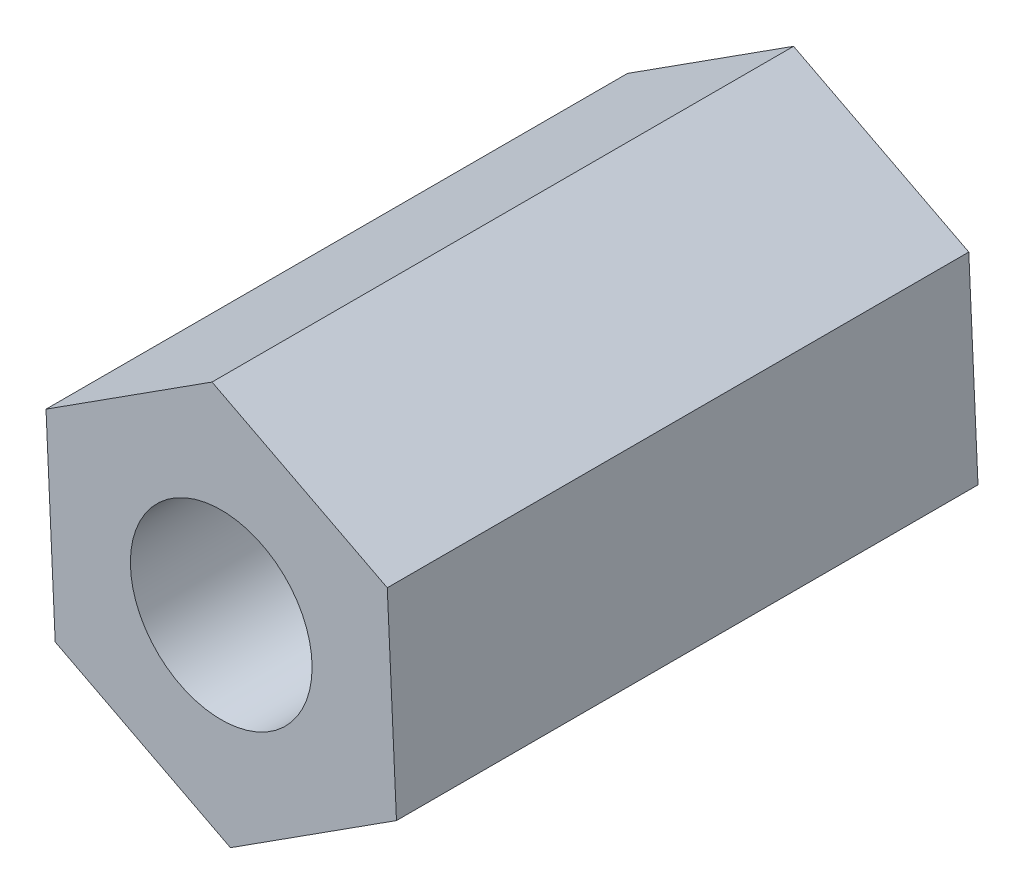
ISO-10303-21;
HEADER;
FILE_DESCRIPTION(('STEP AP214'),'2;1');
FILE_NAME('part.step','',(''),(''),'','','');
FILE_SCHEMA(('AUTOMOTIVE_DESIGN { 1 0 10303 214 1 1 1 1 }'));
ENDSEC;
DATA;
#1=APPLICATION_CONTEXT('core data for automotive mechanical design processes');
#2=APPLICATION_PROTOCOL_DEFINITION('international standard','automotive_design',2000,#1);
#3=PRODUCT_CONTEXT('',#1,'mechanical');
#4=PRODUCT('Part','Part','',(#3));
#5=PRODUCT_RELATED_PRODUCT_CATEGORY('part','',(#4));
#6=PRODUCT_DEFINITION_FORMATION('','',#4);
#7=PRODUCT_DEFINITION_CONTEXT('part definition',#1,'design');
#8=PRODUCT_DEFINITION('design','',#6,#7);
#9=PRODUCT_DEFINITION_SHAPE('','',#8);
#10=(LENGTH_UNIT() NAMED_UNIT(*) SI_UNIT(.MILLI.,.METRE.));
#11=(NAMED_UNIT(*) PLANE_ANGLE_UNIT() SI_UNIT($,.RADIAN.));
#12=(NAMED_UNIT(*) SI_UNIT($,.STERADIAN.) SOLID_ANGLE_UNIT());
#13=UNCERTAINTY_MEASURE_WITH_UNIT(LENGTH_MEASURE(1.E-05),#10,'distance_accuracy_value','');
#14=(GEOMETRIC_REPRESENTATION_CONTEXT(3) GLOBAL_UNCERTAINTY_ASSIGNED_CONTEXT((#13)) GLOBAL_UNIT_ASSIGNED_CONTEXT((#10,
#11,#12)) REPRESENTATION_CONTEXT('',''));
#15=CARTESIAN_POINT('',(0.,0.,0.));
#16=DIRECTION('',(0.,0.,1.));
#17=DIRECTION('',(1.,0.,0.));
#18=AXIS2_PLACEMENT_3D('',#15,#16,#17);
#19=CARTESIAN_POINT('',(2.28413969945886,1.46493657428891,-8.));
#20=DIRECTION('',(-0.459050481047052,-0.888410184458998,0.));
#21=DIRECTION('',(0.888410184458998,-0.459050481047052,0.));
#22=AXIS2_PLACEMENT_3D('',#19,#20,#21);
#23=PLANE('',#22);
#24=DIRECTION('',(-0.888410184458997,0.459050481047052,0.));
#25=VECTOR('',#24,1.);
#26=CARTESIAN_POINT('',(2.28413969945886,1.46493657428891,0.));
#27=LINE('',#26,#25);
#28=CARTESIAN_POINT('',(2.28413969945886,1.46493657428891,0.));
#29=VERTEX_POINT('',#28);
#30=CARTESIAN_POINT('',(-0.126602438537715,2.71059129266838,0.));
#31=VERTEX_POINT('',#30);
#32=EDGE_CURVE('E122',#29,#31,#27,.T.);
#33=ORIENTED_EDGE('',*,*,#32,.F.);
#34=DIRECTION('',(0.,0.,1.));
#35=VECTOR('',#34,1.);
#36=CARTESIAN_POINT('',(2.28413969945886,1.46493657428891,-8.));
#37=LINE('',#36,#35);
#38=CARTESIAN_POINT('',(2.28413969945886,1.46493657428891,-8.));
#39=VERTEX_POINT('',#38);
#40=EDGE_CURVE('E121',#39,#29,#37,.T.);
#41=ORIENTED_EDGE('',*,*,#40,.F.);
#42=DIRECTION('',(-0.888410184458997,0.459050481047052,0.));
#43=VECTOR('',#42,1.);
#44=CARTESIAN_POINT('',(2.28413969945886,1.46493657428891,-8.));
#45=LINE('',#44,#43);
#46=CARTESIAN_POINT('',(-0.126602438537715,2.71059129266838,-8.));
#47=VERTEX_POINT('',#46);
#48=EDGE_CURVE('E135',#39,#47,#45,.T.);
#49=ORIENTED_EDGE('',*,*,#48,.T.);
#50=DIRECTION('',(0.,0.,1.));
#51=VECTOR('',#50,1.);
#52=CARTESIAN_POINT('',(-0.126602438537715,2.71059129266838,-8.));
#53=LINE('',#52,#51);
#54=EDGE_CURVE('E11',#47,#31,#53,.T.);
#55=ORIENTED_EDGE('',*,*,#54,.T.);
#56=EDGE_LOOP('',(#33,#41,#49,#55));
#57=FACE_BOUND('',#56,.T.);
#58=ADVANCED_FACE('F39',(#57),#23,.F.);
#59=CARTESIAN_POINT('',(-0.126602438537715,2.71059129266838,-8.));
#60=DIRECTION('',(0.539860548198785,-0.841754470435713,0.));
#61=DIRECTION('',(0.841754470435713,0.539860548198785,0.));
#62=AXIS2_PLACEMENT_3D('',#59,#60,#61);
#63=PLANE('',#62);
#64=DIRECTION('',(-0.841754470435713,-0.539860548198785,0.));
#65=VECTOR('',#64,1.);
#66=CARTESIAN_POINT('',(-0.126602438537715,2.71059129266838,0.));
#67=LINE('',#66,#65);
#68=CARTESIAN_POINT('',(-2.41074213799657,1.24565471837947,0.));
#69=VERTEX_POINT('',#68);
#70=EDGE_CURVE('E124',#31,#69,#67,.T.);
#71=ORIENTED_EDGE('',*,*,#70,.F.);
#72=ORIENTED_EDGE('',*,*,#54,.F.);
#73=DIRECTION('',(-0.841754470435713,-0.539860548198785,0.));
#74=VECTOR('',#73,1.);
#75=CARTESIAN_POINT('',(-0.126602438537715,2.71059129266838,-8.));
#76=LINE('',#75,#74);
#77=CARTESIAN_POINT('',(-2.41074213799657,1.24565471837947,-8.));
#78=VERTEX_POINT('',#77);
#79=EDGE_CURVE('E87',#47,#78,#76,.T.);
#80=ORIENTED_EDGE('',*,*,#79,.T.);
#81=DIRECTION('',(0.,0.,1.));
#82=VECTOR('',#81,1.);
#83=CARTESIAN_POINT('',(-2.41074213799657,1.24565471837947,-8.));
#84=LINE('',#83,#82);
#85=EDGE_CURVE('E47',#78,#69,#84,.T.);
#86=ORIENTED_EDGE('',*,*,#85,.T.);
#87=EDGE_LOOP('',(#71,#72,#80,#86));
#88=FACE_BOUND('',#87,.T.);
#89=ADVANCED_FACE('F141',(#88),#63,.F.);
#90=CARTESIAN_POINT('',(-2.41074213799657,1.24565471837947,-8.));
#91=DIRECTION('',(0.998911029245837,0.0466557140232844,0.));
#92=DIRECTION('',(-0.0466557140232844,0.998911029245837,0.));
#93=AXIS2_PLACEMENT_3D('',#90,#91,#92);
#94=PLANE('',#93);
#95=DIRECTION('',(0.0466557140232844,-0.998911029245837,0.));
#96=VECTOR('',#95,1.);
#97=CARTESIAN_POINT('',(-2.41074213799657,1.24565471837947,0.));
#98=LINE('',#97,#96);
#99=CARTESIAN_POINT('',(-2.28413969945886,-1.46493657428891,0.));
#100=VERTEX_POINT('',#99);
#101=EDGE_CURVE('E128',#69,#100,#98,.T.);
#102=ORIENTED_EDGE('',*,*,#101,.F.);
#103=ORIENTED_EDGE('',*,*,#85,.F.);
#104=DIRECTION('',(0.0466557140232844,-0.998911029245837,0.));
#105=VECTOR('',#104,1.);
#106=CARTESIAN_POINT('',(-2.41074213799657,1.24565471837947,-8.));
#107=LINE('',#106,#105);
#108=CARTESIAN_POINT('',(-2.28413969945886,-1.46493657428891,-8.));
#109=VERTEX_POINT('',#108);
#110=EDGE_CURVE('E115',#78,#109,#107,.T.);
#111=ORIENTED_EDGE('',*,*,#110,.T.);
#112=DIRECTION('',(0.,0.,1.));
#113=VECTOR('',#112,1.);
#114=CARTESIAN_POINT('',(-2.28413969945886,-1.46493657428891,-8.));
#115=LINE('',#114,#113);
#116=EDGE_CURVE('E109',#109,#100,#115,.T.);
#117=ORIENTED_EDGE('',*,*,#116,.T.);
#118=EDGE_LOOP('',(#102,#103,#111,#117));
#119=FACE_BOUND('',#118,.T.);
#120=ADVANCED_FACE('F170',(#119),#94,.F.);
#121=CARTESIAN_POINT('',(-2.28413969945886,-1.46493657428891,-8.));
#122=DIRECTION('',(0.459050481047052,0.888410184458998,0.));
#123=DIRECTION('',(-0.888410184458998,0.459050481047052,0.));
#124=AXIS2_PLACEMENT_3D('',#121,#122,#123);
#125=PLANE('',#124);
#126=DIRECTION('',(0.888410184458997,-0.459050481047052,0.));
#127=VECTOR('',#126,1.);
#128=CARTESIAN_POINT('',(-2.28413969945886,-1.46493657428891,0.));
#129=LINE('',#128,#127);
#130=CARTESIAN_POINT('',(0.126602438537714,-2.71059129266838,0.));
#131=VERTEX_POINT('',#130);
#132=EDGE_CURVE('E131',#100,#131,#129,.T.);
#133=ORIENTED_EDGE('',*,*,#132,.F.);
#134=ORIENTED_EDGE('',*,*,#116,.F.);
#135=DIRECTION('',(0.888410184458997,-0.459050481047052,0.));
#136=VECTOR('',#135,1.);
#137=CARTESIAN_POINT('',(-2.28413969945886,-1.46493657428891,-8.));
#138=LINE('',#137,#136);
#139=CARTESIAN_POINT('',(0.126602438537714,-2.71059129266838,-8.));
#140=VERTEX_POINT('',#139);
#141=EDGE_CURVE('E99',#109,#140,#138,.T.);
#142=ORIENTED_EDGE('',*,*,#141,.T.);
#143=DIRECTION('',(0.,0.,1.));
#144=VECTOR('',#143,1.);
#145=CARTESIAN_POINT('',(0.126602438537714,-2.71059129266838,-8.));
#146=LINE('',#145,#144);
#147=EDGE_CURVE('E104',#140,#131,#146,.T.);
#148=ORIENTED_EDGE('',*,*,#147,.T.);
#149=EDGE_LOOP('',(#133,#134,#142,#148));
#150=FACE_BOUND('',#149,.T.);
#151=ADVANCED_FACE('F112',(#150),#125,.F.);
#152=CARTESIAN_POINT('',(0.126602438537714,-2.71059129266838,-8.));
#153=DIRECTION('',(-0.539860548198785,0.841754470435713,0.));
#154=DIRECTION('',(-0.841754470435713,-0.539860548198785,0.));
#155=AXIS2_PLACEMENT_3D('',#152,#153,#154);
#156=PLANE('',#155);
#157=DIRECTION('',(0.841754470435713,0.539860548198785,0.));
#158=VECTOR('',#157,1.);
#159=CARTESIAN_POINT('',(0.126602438537714,-2.71059129266838,0.));
#160=LINE('',#159,#158);
#161=CARTESIAN_POINT('',(2.41074213799657,-1.24565471837947,0.));
#162=VERTEX_POINT('',#161);
#163=EDGE_CURVE('E106',#131,#162,#160,.T.);
#164=ORIENTED_EDGE('',*,*,#163,.F.);
#165=ORIENTED_EDGE('',*,*,#147,.F.);
#166=DIRECTION('',(0.841754470435713,0.539860548198785,0.));
#167=VECTOR('',#166,1.);
#168=CARTESIAN_POINT('',(0.126602438537714,-2.71059129266838,-8.));
#169=LINE('',#168,#167);
#170=CARTESIAN_POINT('',(2.41074213799657,-1.24565471837947,-8.));
#171=VERTEX_POINT('',#170);
#172=EDGE_CURVE('E95',#140,#171,#169,.T.);
#173=ORIENTED_EDGE('',*,*,#172,.T.);
#174=DIRECTION('',(0.,0.,1.));
#175=VECTOR('',#174,1.);
#176=CARTESIAN_POINT('',(2.41074213799657,-1.24565471837947,-8.));
#177=LINE('',#176,#175);
#178=EDGE_CURVE('E110',#171,#162,#177,.T.);
#179=ORIENTED_EDGE('',*,*,#178,.T.);
#180=EDGE_LOOP('',(#164,#165,#173,#179));
#181=FACE_BOUND('',#180,.T.);
#182=ADVANCED_FACE('F105',(#181),#156,.F.);
#183=CARTESIAN_POINT('',(2.41074213799657,-1.24565471837947,-8.));
#184=DIRECTION('',(-0.998911029245837,-0.0466557140232842,0.));
#185=DIRECTION('',(0.0466557140232842,-0.998911029245837,0.));
#186=AXIS2_PLACEMENT_3D('',#183,#184,#185);
#187=PLANE('',#186);
#188=DIRECTION('',(-0.0466557140232842,0.998911029245837,0.));
#189=VECTOR('',#188,1.);
#190=CARTESIAN_POINT('',(2.41074213799657,-1.24565471837947,0.));
#191=LINE('',#190,#189);
#192=EDGE_CURVE('E75',#162,#29,#191,.T.);
#193=ORIENTED_EDGE('',*,*,#192,.F.);
#194=ORIENTED_EDGE('',*,*,#178,.F.);
#195=DIRECTION('',(-0.0466557140232842,0.998911029245837,0.));
#196=VECTOR('',#195,1.);
#197=CARTESIAN_POINT('',(2.41074213799657,-1.24565471837947,-8.));
#198=LINE('',#197,#196);
#199=EDGE_CURVE('E55',#171,#39,#198,.T.);
#200=ORIENTED_EDGE('',*,*,#199,.T.);
#201=ORIENTED_EDGE('',*,*,#40,.T.);
#202=EDGE_LOOP('',(#193,#194,#200,#201));
#203=FACE_BOUND('',#202,.T.);
#204=ADVANCED_FACE('F180',(#203),#187,.F.);
#205=CARTESIAN_POINT('',(0.,0.,-8.));
#206=DIRECTION('',(0.,0.,-1.));
#207=DIRECTION('',(1.,0.,0.));
#208=AXIS2_PLACEMENT_3D('',#205,#206,#207);
#209=PLANE('',#208);
#210=CARTESIAN_POINT('',(0.,0.,-8.));
#211=DIRECTION('',(0.,0.,-1.));
#212=DIRECTION('',(-1.,0.,0.));
#213=AXIS2_PLACEMENT_3D('',#210,#211,#212);
#214=CIRCLE('',#213,1.25);
#215=CARTESIAN_POINT('',(-1.25,0.,-8.));
#216=VERTEX_POINT('',#215);
#217=EDGE_CURVE('E125',#216,#216,#214,.T.);
#218=ORIENTED_EDGE('',*,*,#217,.F.);
#219=EDGE_LOOP('',(#218));
#220=FACE_BOUND('',#219,.T.);
#221=ORIENTED_EDGE('',*,*,#48,.F.);
#222=ORIENTED_EDGE('',*,*,#199,.F.);
#223=ORIENTED_EDGE('',*,*,#172,.F.);
#224=ORIENTED_EDGE('',*,*,#141,.F.);
#225=ORIENTED_EDGE('',*,*,#110,.F.);
#226=ORIENTED_EDGE('',*,*,#79,.F.);
#227=EDGE_LOOP('',(#221,#222,#223,#224,#225,#226));
#228=FACE_BOUND('',#227,.T.);
#229=ADVANCED_FACE('F97',(#220,#228),#209,.T.);
#230=CARTESIAN_POINT('',(0.,0.,0.));
#231=DIRECTION('',(0.,0.,-1.));
#232=DIRECTION('',(1.,0.,0.));
#233=AXIS2_PLACEMENT_3D('',#230,#231,#232);
#234=PLANE('',#233);
#235=CARTESIAN_POINT('',(0.,0.,0.));
#236=DIRECTION('',(0.,0.,-1.));
#237=DIRECTION('',(-1.,0.,0.));
#238=AXIS2_PLACEMENT_3D('',#235,#236,#237);
#239=CIRCLE('',#238,1.24999999999999);
#240=CARTESIAN_POINT('',(-1.24999999999999,0.,0.));
#241=VERTEX_POINT('',#240);
#242=EDGE_CURVE('E152',#241,#241,#239,.T.);
#243=ORIENTED_EDGE('',*,*,#242,.T.);
#244=EDGE_LOOP('',(#243));
#245=FACE_BOUND('',#244,.T.);
#246=ORIENTED_EDGE('',*,*,#32,.T.);
#247=ORIENTED_EDGE('',*,*,#70,.T.);
#248=ORIENTED_EDGE('',*,*,#101,.T.);
#249=ORIENTED_EDGE('',*,*,#132,.T.);
#250=ORIENTED_EDGE('',*,*,#163,.T.);
#251=ORIENTED_EDGE('',*,*,#192,.T.);
#252=EDGE_LOOP('',(#246,#247,#248,#249,#250,#251));
#253=FACE_BOUND('',#252,.T.);
#254=ADVANCED_FACE('F143',(#245,#253),#234,.F.);
#255=CARTESIAN_POINT('',(0.,0.,0.));
#256=DIRECTION('',(0.,0.,1.));
#257=DIRECTION('',(-1.,0.,0.));
#258=AXIS2_PLACEMENT_3D('',#255,#256,#257);
#259=CYLINDRICAL_SURFACE('',#258,1.24999999999999);
#260=ORIENTED_EDGE('',*,*,#217,.T.);
#261=EDGE_LOOP('',(#260));
#262=FACE_BOUND('',#261,.T.);
#263=ORIENTED_EDGE('',*,*,#242,.F.);
#264=EDGE_LOOP('',(#263));
#265=FACE_BOUND('',#264,.T.);
#266=ADVANCED_FACE('F157',(#262,#265),#259,.F.);
#267=CLOSED_SHELL('',(#58,#89,#120,#151,#182,#204,#229,#254,#266));
#268=MANIFOLD_SOLID_BREP('B2',#267);
#269=ADVANCED_BREP_SHAPE_REPRESENTATION('',(#18,#268),#14);
#270=SHAPE_DEFINITION_REPRESENTATION(#9,#269);
ENDSEC;
END-ISO-10303-21;
